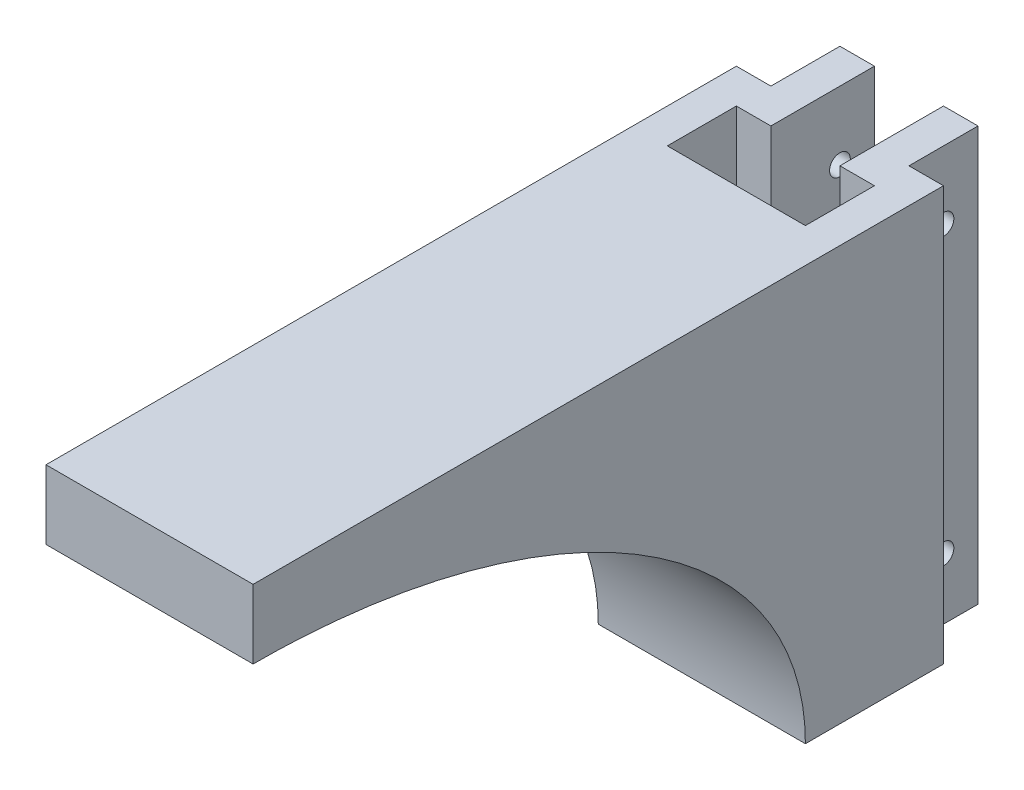
ISO-10303-21;
HEADER;
FILE_DESCRIPTION(('STEP AP214'),'2;1');
FILE_NAME('part.step','',(''),(''),'','','');
FILE_SCHEMA(('AUTOMOTIVE_DESIGN { 1 0 10303 214 1 1 1 1 }'));
ENDSEC;
DATA;
#1=APPLICATION_CONTEXT('core data for automotive mechanical design processes');
#2=APPLICATION_PROTOCOL_DEFINITION('international standard','automotive_design',2000,#1);
#3=PRODUCT_CONTEXT('',#1,'mechanical');
#4=PRODUCT('Part','Part','',(#3));
#5=PRODUCT_RELATED_PRODUCT_CATEGORY('part','',(#4));
#6=PRODUCT_DEFINITION_FORMATION('','',#4);
#7=PRODUCT_DEFINITION_CONTEXT('part definition',#1,'design');
#8=PRODUCT_DEFINITION('design','',#6,#7);
#9=PRODUCT_DEFINITION_SHAPE('','',#8);
#10=(LENGTH_UNIT() NAMED_UNIT(*) SI_UNIT(.MILLI.,.METRE.));
#11=(NAMED_UNIT(*) PLANE_ANGLE_UNIT() SI_UNIT($,.RADIAN.));
#12=(NAMED_UNIT(*) SI_UNIT($,.STERADIAN.) SOLID_ANGLE_UNIT());
#13=UNCERTAINTY_MEASURE_WITH_UNIT(LENGTH_MEASURE(1.E-05),#10,'distance_accuracy_value','');
#14=(GEOMETRIC_REPRESENTATION_CONTEXT(3) GLOBAL_UNCERTAINTY_ASSIGNED_CONTEXT((#13)) GLOBAL_UNIT_ASSIGNED_CONTEXT((#10,
#11,#12)) REPRESENTATION_CONTEXT('',''));
#15=CARTESIAN_POINT('',(0.,0.,0.));
#16=DIRECTION('',(0.,0.,1.));
#17=DIRECTION('',(1.,0.,0.));
#18=AXIS2_PLACEMENT_3D('',#15,#16,#17);
#19=CARTESIAN_POINT('',(-5.,60.,-20.));
#20=DIRECTION('',(-1.,0.,0.));
#21=DIRECTION('',(0.,0.,1.));
#22=AXIS2_PLACEMENT_3D('',#19,#20,#21);
#23=PLANE('',#22);
#24=CARTESIAN_POINT('',(-5.,50.141064744388,-15.));
#25=DIRECTION('',(-1.,0.,0.));
#26=DIRECTION('',(0.,0.,1.));
#27=AXIS2_PLACEMENT_3D('',#24,#25,#26);
#28=CIRCLE('',#27,1.5);
#29=CARTESIAN_POINT('',(-5.,50.141064744388,-13.5));
#30=VERTEX_POINT('',#29);
#31=EDGE_CURVE('E303',#30,#30,#28,.T.);
#32=ORIENTED_EDGE('',*,*,#31,.T.);
#33=EDGE_LOOP('',(#32));
#34=FACE_BOUND('',#33,.T.);
#35=CARTESIAN_POINT('',(-5.,8.81024275743576,-15.));
#36=DIRECTION('',(-1.,0.,0.));
#37=DIRECTION('',(0.,0.,1.));
#38=AXIS2_PLACEMENT_3D('',#35,#36,#37);
#39=CIRCLE('',#38,1.5);
#40=CARTESIAN_POINT('',(-5.,8.81024275743576,-13.5));
#41=VERTEX_POINT('',#40);
#42=EDGE_CURVE('E285',#41,#41,#39,.T.);
#43=ORIENTED_EDGE('',*,*,#42,.T.);
#44=EDGE_LOOP('',(#43));
#45=FACE_BOUND('',#44,.T.);
#46=DIRECTION('',(0.,0.,-1.));
#47=VECTOR('',#46,1.);
#48=CARTESIAN_POINT('',(-5.,0.,-20.));
#49=LINE('',#48,#47);
#50=CARTESIAN_POINT('',(-5.,0.,-5.));
#51=VERTEX_POINT('',#50);
#52=CARTESIAN_POINT('',(-5.,0.,-20.));
#53=VERTEX_POINT('',#52);
#54=EDGE_CURVE('E186',#51,#53,#49,.T.);
#55=ORIENTED_EDGE('',*,*,#54,.T.);
#56=DIRECTION('',(0.,-1.,0.));
#57=VECTOR('',#56,1.);
#58=CARTESIAN_POINT('',(-5.,60.,-20.));
#59=LINE('',#58,#57);
#60=CARTESIAN_POINT('',(-5.,60.,-20.));
#61=VERTEX_POINT('',#60);
#62=EDGE_CURVE('E11',#61,#53,#59,.T.);
#63=ORIENTED_EDGE('',*,*,#62,.F.);
#64=DIRECTION('',(0.,0.,-1.));
#65=VECTOR('',#64,1.);
#66=CARTESIAN_POINT('',(-5.,60.,-20.));
#67=LINE('',#66,#65);
#68=CARTESIAN_POINT('',(-5.,60.,-5.));
#69=VERTEX_POINT('',#68);
#70=EDGE_CURVE('E123',#69,#61,#67,.T.);
#71=ORIENTED_EDGE('',*,*,#70,.F.);
#72=DIRECTION('',(0.,-1.,0.));
#73=VECTOR('',#72,1.);
#74=CARTESIAN_POINT('',(-5.,60.,-5.));
#75=LINE('',#74,#73);
#76=EDGE_CURVE('E182',#69,#51,#75,.T.);
#77=ORIENTED_EDGE('',*,*,#76,.T.);
#78=EDGE_LOOP('',(#55,#63,#71,#77));
#79=FACE_BOUND('',#78,.T.);
#80=ADVANCED_FACE('F42',(#34,#45,#79),#23,.F.);
#81=CARTESIAN_POINT('',(-10.,60.,-20.));
#82=DIRECTION('',(0.,0.,-1.));
#83=DIRECTION('',(-1.,0.,0.));
#84=AXIS2_PLACEMENT_3D('',#81,#82,#83);
#85=PLANE('',#84);
#86=DIRECTION('',(1.,0.,0.));
#87=VECTOR('',#86,1.);
#88=CARTESIAN_POINT('',(-10.,0.,-20.));
#89=LINE('',#88,#87);
#90=CARTESIAN_POINT('',(-10.,0.,-20.));
#91=VERTEX_POINT('',#90);
#92=EDGE_CURVE('E190',#91,#53,#89,.T.);
#93=ORIENTED_EDGE('',*,*,#92,.F.);
#94=DIRECTION('',(0.,-1.,0.));
#95=VECTOR('',#94,1.);
#96=CARTESIAN_POINT('',(-10.,60.,-20.));
#97=LINE('',#96,#95);
#98=CARTESIAN_POINT('',(-10.,60.,-20.));
#99=VERTEX_POINT('',#98);
#100=EDGE_CURVE('E52',#99,#91,#97,.T.);
#101=ORIENTED_EDGE('',*,*,#100,.F.);
#102=DIRECTION('',(1.,0.,0.));
#103=VECTOR('',#102,1.);
#104=CARTESIAN_POINT('',(-10.,60.,-20.));
#105=LINE('',#104,#103);
#106=EDGE_CURVE('E404',#99,#61,#105,.T.);
#107=ORIENTED_EDGE('',*,*,#106,.T.);
#108=ORIENTED_EDGE('',*,*,#62,.T.);
#109=EDGE_LOOP('',(#93,#101,#107,#108));
#110=FACE_BOUND('',#109,.T.);
#111=ADVANCED_FACE('F381',(#110),#85,.T.);
#112=CARTESIAN_POINT('',(-10.,60.,-20.));
#113=DIRECTION('',(-1.,0.,0.));
#114=DIRECTION('',(0.,0.,1.));
#115=AXIS2_PLACEMENT_3D('',#112,#113,#114);
#116=PLANE('',#115);
#117=CARTESIAN_POINT('',(-10.,50.141064744388,-15.));
#118=DIRECTION('',(-1.,0.,0.));
#119=DIRECTION('',(0.,0.,1.));
#120=AXIS2_PLACEMENT_3D('',#117,#118,#119);
#121=CIRCLE('',#120,1.5);
#122=CARTESIAN_POINT('',(-10.,50.141064744388,-13.5));
#123=VERTEX_POINT('',#122);
#124=EDGE_CURVE('E279',#123,#123,#121,.T.);
#125=ORIENTED_EDGE('',*,*,#124,.F.);
#126=EDGE_LOOP('',(#125));
#127=FACE_BOUND('',#126,.T.);
#128=CARTESIAN_POINT('',(-10.,8.81024275743576,-15.));
#129=DIRECTION('',(-1.,0.,0.));
#130=DIRECTION('',(0.,0.,1.));
#131=AXIS2_PLACEMENT_3D('',#128,#129,#130);
#132=CIRCLE('',#131,1.5);
#133=CARTESIAN_POINT('',(-10.,8.81024275743576,-13.5));
#134=VERTEX_POINT('',#133);
#135=EDGE_CURVE('E288',#134,#134,#132,.T.);
#136=ORIENTED_EDGE('',*,*,#135,.F.);
#137=EDGE_LOOP('',(#136));
#138=FACE_BOUND('',#137,.T.);
#139=DIRECTION('',(0.,0.,-1.));
#140=VECTOR('',#139,1.);
#141=CARTESIAN_POINT('',(-10.,0.,-20.));
#142=LINE('',#141,#140);
#143=CARTESIAN_POINT('',(-10.,0.,-10.));
#144=VERTEX_POINT('',#143);
#145=EDGE_CURVE('E195',#144,#91,#142,.T.);
#146=ORIENTED_EDGE('',*,*,#145,.F.);
#147=DIRECTION('',(0.,-1.,0.));
#148=VECTOR('',#147,1.);
#149=CARTESIAN_POINT('',(-10.,60.,-10.));
#150=LINE('',#149,#148);
#151=CARTESIAN_POINT('',(-10.,60.,-10.));
#152=VERTEX_POINT('',#151);
#153=EDGE_CURVE('E271',#152,#144,#150,.T.);
#154=ORIENTED_EDGE('',*,*,#153,.F.);
#155=DIRECTION('',(0.,0.,-1.));
#156=VECTOR('',#155,1.);
#157=CARTESIAN_POINT('',(-10.,60.,-20.));
#158=LINE('',#157,#156);
#159=EDGE_CURVE('E399',#152,#99,#158,.T.);
#160=ORIENTED_EDGE('',*,*,#159,.T.);
#161=ORIENTED_EDGE('',*,*,#100,.T.);
#162=EDGE_LOOP('',(#146,#154,#160,#161));
#163=FACE_BOUND('',#162,.T.);
#164=ADVANCED_FACE('F378',(#127,#138,#163),#116,.T.);
#165=CARTESIAN_POINT('',(-5.,60.,-10.));
#166=DIRECTION('',(0.,0.,-1.));
#167=DIRECTION('',(-1.,0.,0.));
#168=AXIS2_PLACEMENT_3D('',#165,#166,#167);
#169=PLANE('',#168);
#170=DIRECTION('',(1.,0.,0.));
#171=VECTOR('',#170,1.);
#172=CARTESIAN_POINT('',(-5.,0.,-10.));
#173=LINE('',#172,#171);
#174=CARTESIAN_POINT('',(-15.,0.,-10.));
#175=VERTEX_POINT('',#174);
#176=EDGE_CURVE('E199',#175,#144,#173,.T.);
#177=ORIENTED_EDGE('',*,*,#176,.F.);
#178=DIRECTION('',(0.,-1.,0.));
#179=VECTOR('',#178,1.);
#180=CARTESIAN_POINT('',(-15.,60.,-10.));
#181=LINE('',#180,#179);
#182=CARTESIAN_POINT('',(-15.,60.,-10.));
#183=VERTEX_POINT('',#182);
#184=EDGE_CURVE('E268',#183,#175,#181,.T.);
#185=ORIENTED_EDGE('',*,*,#184,.F.);
#186=DIRECTION('',(1.,0.,0.));
#187=VECTOR('',#186,1.);
#188=CARTESIAN_POINT('',(-5.,60.,-10.));
#189=LINE('',#188,#187);
#190=EDGE_CURVE('E403',#183,#152,#189,.T.);
#191=ORIENTED_EDGE('',*,*,#190,.T.);
#192=ORIENTED_EDGE('',*,*,#153,.T.);
#193=EDGE_LOOP('',(#177,#185,#191,#192));
#194=FACE_BOUND('',#193,.T.);
#195=ADVANCED_FACE('F374',(#194),#169,.T.);
#196=CARTESIAN_POINT('',(-15.,60.,-5.));
#197=DIRECTION('',(-1.,0.,0.));
#198=DIRECTION('',(0.,0.,1.));
#199=AXIS2_PLACEMENT_3D('',#196,#197,#198);
#200=PLANE('',#199);
#201=DIRECTION('',(0.,0.,-1.));
#202=VECTOR('',#201,1.);
#203=CARTESIAN_POINT('',(-15.,0.,-5.));
#204=LINE('',#203,#202);
#205=CARTESIAN_POINT('',(-15.,0.,10.));
#206=VERTEX_POINT('',#205);
#207=EDGE_CURVE('E203',#206,#175,#204,.T.);
#208=ORIENTED_EDGE('',*,*,#207,.F.);
#209=CARTESIAN_POINT('',(-15.,0.,90.));
#210=DIRECTION('',(1.,0.,0.));
#211=DIRECTION('',(0.,0.,-1.));
#212=AXIS2_PLACEMENT_3D('',#209,#210,#211);
#213=ELLIPSE('',#212,80.,50.);
#214=CARTESIAN_POINT('',(-15.,50.,90.));
#215=VERTEX_POINT('',#214);
#216=EDGE_CURVE('E307',#206,#215,#213,.T.);
#217=ORIENTED_EDGE('',*,*,#216,.T.);
#218=DIRECTION('',(0.,1.,0.));
#219=VECTOR('',#218,1.);
#220=CARTESIAN_POINT('',(-15.,0.,90.));
#221=LINE('',#220,#219);
#222=CARTESIAN_POINT('',(-15.,60.,90.));
#223=VERTEX_POINT('',#222);
#224=EDGE_CURVE('E311',#215,#223,#221,.T.);
#225=ORIENTED_EDGE('',*,*,#224,.T.);
#226=DIRECTION('',(0.,0.,-1.));
#227=VECTOR('',#226,1.);
#228=CARTESIAN_POINT('',(-15.,60.,-5.));
#229=LINE('',#228,#227);
#230=EDGE_CURVE('E408',#223,#183,#229,.T.);
#231=ORIENTED_EDGE('',*,*,#230,.T.);
#232=ORIENTED_EDGE('',*,*,#184,.T.);
#233=EDGE_LOOP('',(#208,#217,#225,#231,#232));
#234=FACE_BOUND('',#233,.T.);
#235=ADVANCED_FACE('F370',(#234),#200,.T.);
#236=CARTESIAN_POINT('',(15.,60.,-5.));
#237=DIRECTION('',(1.,0.,0.));
#238=DIRECTION('',(0.,0.,-1.));
#239=AXIS2_PLACEMENT_3D('',#236,#237,#238);
#240=PLANE('',#239);
#241=DIRECTION('',(0.,0.,-1.));
#242=VECTOR('',#241,1.);
#243=CARTESIAN_POINT('',(15.,0.,-5.));
#244=LINE('',#243,#242);
#245=CARTESIAN_POINT('',(15.,0.,-10.));
#246=VERTEX_POINT('',#245);
#247=CARTESIAN_POINT('',(15.,0.,10.));
#248=VERTEX_POINT('',#247);
#249=EDGE_CURVE('E211',#246,#248,#244,.F.);
#250=ORIENTED_EDGE('',*,*,#249,.F.);
#251=DIRECTION('',(0.,-1.,0.));
#252=VECTOR('',#251,1.);
#253=CARTESIAN_POINT('',(15.,60.,-10.));
#254=LINE('',#253,#252);
#255=CARTESIAN_POINT('',(15.,60.,-10.));
#256=VERTEX_POINT('',#255);
#257=EDGE_CURVE('E265',#256,#246,#254,.T.);
#258=ORIENTED_EDGE('',*,*,#257,.F.);
#259=DIRECTION('',(0.,0.,-1.));
#260=VECTOR('',#259,1.);
#261=CARTESIAN_POINT('',(15.,60.,-5.));
#262=LINE('',#261,#260);
#263=CARTESIAN_POINT('',(15.,60.,90.));
#264=VERTEX_POINT('',#263);
#265=EDGE_CURVE('E416',#256,#264,#262,.F.);
#266=ORIENTED_EDGE('',*,*,#265,.T.);
#267=DIRECTION('',(0.,1.,0.));
#268=VECTOR('',#267,1.);
#269=CARTESIAN_POINT('',(15.,0.,90.));
#270=LINE('',#269,#268);
#271=CARTESIAN_POINT('',(15.,50.,90.));
#272=VERTEX_POINT('',#271);
#273=EDGE_CURVE('E320',#272,#264,#270,.T.);
#274=ORIENTED_EDGE('',*,*,#273,.F.);
#275=CARTESIAN_POINT('',(15.,0.,90.));
#276=DIRECTION('',(1.,0.,0.));
#277=DIRECTION('',(0.,0.,-1.));
#278=AXIS2_PLACEMENT_3D('',#275,#276,#277);
#279=ELLIPSE('',#278,80.,50.);
#280=EDGE_CURVE('E315',#248,#272,#279,.T.);
#281=ORIENTED_EDGE('',*,*,#280,.F.);
#282=EDGE_LOOP('',(#250,#258,#266,#274,#281));
#283=FACE_BOUND('',#282,.T.);
#284=ADVANCED_FACE('F366',(#283),#240,.T.);
#285=CARTESIAN_POINT('',(5.,60.,-10.));
#286=DIRECTION('',(0.,0.,-1.));
#287=DIRECTION('',(-1.,0.,0.));
#288=AXIS2_PLACEMENT_3D('',#285,#286,#287);
#289=PLANE('',#288);
#290=DIRECTION('',(1.,0.,0.));
#291=VECTOR('',#290,1.);
#292=CARTESIAN_POINT('',(5.,0.,-10.));
#293=LINE('',#292,#291);
#294=CARTESIAN_POINT('',(10.,0.,-10.));
#295=VERTEX_POINT('',#294);
#296=EDGE_CURVE('E215',#295,#246,#293,.T.);
#297=ORIENTED_EDGE('',*,*,#296,.F.);
#298=DIRECTION('',(0.,-1.,0.));
#299=VECTOR('',#298,1.);
#300=CARTESIAN_POINT('',(10.,60.,-10.));
#301=LINE('',#300,#299);
#302=CARTESIAN_POINT('',(10.,60.,-10.));
#303=VERTEX_POINT('',#302);
#304=EDGE_CURVE('E262',#303,#295,#301,.T.);
#305=ORIENTED_EDGE('',*,*,#304,.F.);
#306=DIRECTION('',(1.,0.,0.));
#307=VECTOR('',#306,1.);
#308=CARTESIAN_POINT('',(5.,60.,-10.));
#309=LINE('',#308,#307);
#310=EDGE_CURVE('E420',#303,#256,#309,.T.);
#311=ORIENTED_EDGE('',*,*,#310,.T.);
#312=ORIENTED_EDGE('',*,*,#257,.T.);
#313=EDGE_LOOP('',(#297,#305,#311,#312));
#314=FACE_BOUND('',#313,.T.);
#315=ADVANCED_FACE('F362',(#314),#289,.T.);
#316=CARTESIAN_POINT('',(10.,60.,-20.));
#317=DIRECTION('',(1.,0.,0.));
#318=DIRECTION('',(0.,0.,-1.));
#319=AXIS2_PLACEMENT_3D('',#316,#317,#318);
#320=PLANE('',#319);
#321=CARTESIAN_POINT('',(10.,50.141064744388,-15.));
#322=DIRECTION('',(1.,0.,0.));
#323=DIRECTION('',(0.,0.,-1.));
#324=AXIS2_PLACEMENT_3D('',#321,#322,#323);
#325=CIRCLE('',#324,1.5);
#326=CARTESIAN_POINT('',(10.,50.141064744388,-13.5));
#327=VERTEX_POINT('',#326);
#328=EDGE_CURVE('E299',#327,#327,#325,.T.);
#329=ORIENTED_EDGE('',*,*,#328,.F.);
#330=EDGE_LOOP('',(#329));
#331=FACE_BOUND('',#330,.T.);
#332=CARTESIAN_POINT('',(10.,8.81024275743576,-15.));
#333=DIRECTION('',(1.,0.,0.));
#334=DIRECTION('',(0.,0.,-1.));
#335=AXIS2_PLACEMENT_3D('',#332,#333,#334);
#336=CIRCLE('',#335,1.5);
#337=CARTESIAN_POINT('',(10.,8.81024275743576,-13.5));
#338=VERTEX_POINT('',#337);
#339=EDGE_CURVE('E278',#338,#338,#336,.T.);
#340=ORIENTED_EDGE('',*,*,#339,.F.);
#341=EDGE_LOOP('',(#340));
#342=FACE_BOUND('',#341,.T.);
#343=DIRECTION('',(0.,0.,1.));
#344=VECTOR('',#343,1.);
#345=CARTESIAN_POINT('',(10.,0.,-20.));
#346=LINE('',#345,#344);
#347=CARTESIAN_POINT('',(10.,0.,-20.));
#348=VERTEX_POINT('',#347);
#349=EDGE_CURVE('E219',#348,#295,#346,.T.);
#350=ORIENTED_EDGE('',*,*,#349,.F.);
#351=DIRECTION('',(0.,-1.,0.));
#352=VECTOR('',#351,1.);
#353=CARTESIAN_POINT('',(10.,60.,-20.));
#354=LINE('',#353,#352);
#355=CARTESIAN_POINT('',(10.,60.,-20.));
#356=VERTEX_POINT('',#355);
#357=EDGE_CURVE('E259',#356,#348,#354,.T.);
#358=ORIENTED_EDGE('',*,*,#357,.F.);
#359=DIRECTION('',(0.,0.,1.));
#360=VECTOR('',#359,1.);
#361=CARTESIAN_POINT('',(10.,60.,-20.));
#362=LINE('',#361,#360);
#363=EDGE_CURVE('E424',#356,#303,#362,.T.);
#364=ORIENTED_EDGE('',*,*,#363,.T.);
#365=ORIENTED_EDGE('',*,*,#304,.T.);
#366=EDGE_LOOP('',(#350,#358,#364,#365));
#367=FACE_BOUND('',#366,.T.);
#368=ADVANCED_FACE('F358',(#331,#342,#367),#320,.T.);
#369=CARTESIAN_POINT('',(5.,60.,-20.));
#370=DIRECTION('',(0.,0.,-1.));
#371=DIRECTION('',(-1.,0.,0.));
#372=AXIS2_PLACEMENT_3D('',#369,#370,#371);
#373=PLANE('',#372);
#374=DIRECTION('',(1.,0.,0.));
#375=VECTOR('',#374,1.);
#376=CARTESIAN_POINT('',(5.,0.,-20.));
#377=LINE('',#376,#375);
#378=CARTESIAN_POINT('',(5.,0.,-20.));
#379=VERTEX_POINT('',#378);
#380=EDGE_CURVE('E223',#379,#348,#377,.T.);
#381=ORIENTED_EDGE('',*,*,#380,.F.);
#382=DIRECTION('',(0.,-1.,0.));
#383=VECTOR('',#382,1.);
#384=CARTESIAN_POINT('',(5.,60.,-20.));
#385=LINE('',#384,#383);
#386=CARTESIAN_POINT('',(5.,60.,-20.));
#387=VERTEX_POINT('',#386);
#388=EDGE_CURVE('E256',#387,#379,#385,.T.);
#389=ORIENTED_EDGE('',*,*,#388,.F.);
#390=DIRECTION('',(1.,0.,0.));
#391=VECTOR('',#390,1.);
#392=CARTESIAN_POINT('',(5.,60.,-20.));
#393=LINE('',#392,#391);
#394=EDGE_CURVE('E428',#387,#356,#393,.T.);
#395=ORIENTED_EDGE('',*,*,#394,.T.);
#396=ORIENTED_EDGE('',*,*,#357,.T.);
#397=EDGE_LOOP('',(#381,#389,#395,#396));
#398=FACE_BOUND('',#397,.T.);
#399=ADVANCED_FACE('F354',(#398),#373,.T.);
#400=CARTESIAN_POINT('',(5.,60.,-20.));
#401=DIRECTION('',(1.,0.,0.));
#402=DIRECTION('',(0.,0.,-1.));
#403=AXIS2_PLACEMENT_3D('',#400,#401,#402);
#404=PLANE('',#403);
#405=CARTESIAN_POINT('',(5.,50.141064744388,-15.));
#406=DIRECTION('',(1.,0.,0.));
#407=DIRECTION('',(0.,0.,-1.));
#408=AXIS2_PLACEMENT_3D('',#405,#406,#407);
#409=CIRCLE('',#408,1.5);
#410=CARTESIAN_POINT('',(5.,50.141064744388,-13.5));
#411=VERTEX_POINT('',#410);
#412=EDGE_CURVE('E45',#411,#411,#409,.T.);
#413=ORIENTED_EDGE('',*,*,#412,.T.);
#414=EDGE_LOOP('',(#413));
#415=FACE_BOUND('',#414,.T.);
#416=CARTESIAN_POINT('',(5.,8.81024275743576,-15.));
#417=DIRECTION('',(1.,0.,0.));
#418=DIRECTION('',(0.,0.,-1.));
#419=AXIS2_PLACEMENT_3D('',#416,#417,#418);
#420=CIRCLE('',#419,1.5);
#421=CARTESIAN_POINT('',(5.,8.81024275743576,-13.5));
#422=VERTEX_POINT('',#421);
#423=EDGE_CURVE('E275',#422,#422,#420,.T.);
#424=ORIENTED_EDGE('',*,*,#423,.T.);
#425=EDGE_LOOP('',(#424));
#426=FACE_BOUND('',#425,.T.);
#427=DIRECTION('',(0.,0.,1.));
#428=VECTOR('',#427,1.);
#429=CARTESIAN_POINT('',(5.,0.,-20.));
#430=LINE('',#429,#428);
#431=CARTESIAN_POINT('',(5.,0.,-5.));
#432=VERTEX_POINT('',#431);
#433=EDGE_CURVE('E227',#379,#432,#430,.T.);
#434=ORIENTED_EDGE('',*,*,#433,.T.);
#435=DIRECTION('',(0.,-1.,0.));
#436=VECTOR('',#435,1.);
#437=CARTESIAN_POINT('',(5.,60.,-5.));
#438=LINE('',#437,#436);
#439=CARTESIAN_POINT('',(5.,60.,-5.));
#440=VERTEX_POINT('',#439);
#441=EDGE_CURVE('E252',#440,#432,#438,.T.);
#442=ORIENTED_EDGE('',*,*,#441,.F.);
#443=DIRECTION('',(0.,0.,1.));
#444=VECTOR('',#443,1.);
#445=CARTESIAN_POINT('',(5.,60.,-20.));
#446=LINE('',#445,#444);
#447=EDGE_CURVE('E432',#387,#440,#446,.T.);
#448=ORIENTED_EDGE('',*,*,#447,.F.);
#449=ORIENTED_EDGE('',*,*,#388,.T.);
#450=EDGE_LOOP('',(#434,#442,#448,#449));
#451=FACE_BOUND('',#450,.T.);
#452=ADVANCED_FACE('F350',(#415,#426,#451),#404,.F.);
#453=CARTESIAN_POINT('',(5.,60.,-5.));
#454=DIRECTION('',(0.,0.,-1.));
#455=DIRECTION('',(-1.,0.,0.));
#456=AXIS2_PLACEMENT_3D('',#453,#454,#455);
#457=PLANE('',#456);
#458=DIRECTION('',(1.,0.,0.));
#459=VECTOR('',#458,1.);
#460=CARTESIAN_POINT('',(5.,0.,-5.));
#461=LINE('',#460,#459);
#462=CARTESIAN_POINT('',(10.,0.,-5.));
#463=VERTEX_POINT('',#462);
#464=EDGE_CURVE('E230',#432,#463,#461,.T.);
#465=ORIENTED_EDGE('',*,*,#464,.T.);
#466=DIRECTION('',(0.,-1.,0.));
#467=VECTOR('',#466,1.);
#468=CARTESIAN_POINT('',(10.,60.,-5.));
#469=LINE('',#468,#467);
#470=CARTESIAN_POINT('',(10.,60.,-5.));
#471=VERTEX_POINT('',#470);
#472=EDGE_CURVE('E248',#471,#463,#469,.T.);
#473=ORIENTED_EDGE('',*,*,#472,.F.);
#474=DIRECTION('',(1.,0.,0.));
#475=VECTOR('',#474,1.);
#476=CARTESIAN_POINT('',(5.,60.,-5.));
#477=LINE('',#476,#475);
#478=EDGE_CURVE('E435',#440,#471,#477,.T.);
#479=ORIENTED_EDGE('',*,*,#478,.F.);
#480=ORIENTED_EDGE('',*,*,#441,.T.);
#481=EDGE_LOOP('',(#465,#473,#479,#480));
#482=FACE_BOUND('',#481,.T.);
#483=ADVANCED_FACE('F346',(#482),#457,.F.);
#484=CARTESIAN_POINT('',(10.,60.,-5.));
#485=DIRECTION('',(1.,0.,0.));
#486=DIRECTION('',(0.,0.,-1.));
#487=AXIS2_PLACEMENT_3D('',#484,#485,#486);
#488=PLANE('',#487);
#489=DIRECTION('',(0.,0.,1.));
#490=VECTOR('',#489,1.);
#491=CARTESIAN_POINT('',(10.,0.,-5.));
#492=LINE('',#491,#490);
#493=CARTESIAN_POINT('',(10.,0.,5.));
#494=VERTEX_POINT('',#493);
#495=EDGE_CURVE('E233',#463,#494,#492,.T.);
#496=ORIENTED_EDGE('',*,*,#495,.T.);
#497=DIRECTION('',(0.,-1.,0.));
#498=VECTOR('',#497,1.);
#499=CARTESIAN_POINT('',(10.,60.,5.));
#500=LINE('',#499,#498);
#501=CARTESIAN_POINT('',(10.,60.,5.));
#502=VERTEX_POINT('',#501);
#503=EDGE_CURVE('E175',#502,#494,#500,.T.);
#504=ORIENTED_EDGE('',*,*,#503,.F.);
#505=DIRECTION('',(0.,0.,1.));
#506=VECTOR('',#505,1.);
#507=CARTESIAN_POINT('',(10.,60.,-5.));
#508=LINE('',#507,#506);
#509=EDGE_CURVE('E164',#471,#502,#508,.T.);
#510=ORIENTED_EDGE('',*,*,#509,.F.);
#511=ORIENTED_EDGE('',*,*,#472,.T.);
#512=EDGE_LOOP('',(#496,#504,#510,#511));
#513=FACE_BOUND('',#512,.T.);
#514=ADVANCED_FACE('F343',(#513),#488,.F.);
#515=CARTESIAN_POINT('',(-10.,60.,5.));
#516=DIRECTION('',(0.,0.,1.));
#517=DIRECTION('',(1.,0.,0.));
#518=AXIS2_PLACEMENT_3D('',#515,#516,#517);
#519=PLANE('',#518);
#520=DIRECTION('',(-1.,0.,0.));
#521=VECTOR('',#520,1.);
#522=CARTESIAN_POINT('',(-10.,0.,5.));
#523=LINE('',#522,#521);
#524=CARTESIAN_POINT('',(-10.,0.,5.));
#525=VERTEX_POINT('',#524);
#526=EDGE_CURVE('E173',#494,#525,#523,.T.);
#527=ORIENTED_EDGE('',*,*,#526,.T.);
#528=DIRECTION('',(0.,-1.,0.));
#529=VECTOR('',#528,1.);
#530=CARTESIAN_POINT('',(-10.,60.,5.));
#531=LINE('',#530,#529);
#532=CARTESIAN_POINT('',(-10.,60.,5.));
#533=VERTEX_POINT('',#532);
#534=EDGE_CURVE('E170',#533,#525,#531,.T.);
#535=ORIENTED_EDGE('',*,*,#534,.F.);
#536=DIRECTION('',(-1.,0.,0.));
#537=VECTOR('',#536,1.);
#538=CARTESIAN_POINT('',(-10.,60.,5.));
#539=LINE('',#538,#537);
#540=EDGE_CURVE('E158',#502,#533,#539,.T.);
#541=ORIENTED_EDGE('',*,*,#540,.F.);
#542=ORIENTED_EDGE('',*,*,#503,.T.);
#543=EDGE_LOOP('',(#527,#535,#541,#542));
#544=FACE_BOUND('',#543,.T.);
#545=ADVANCED_FACE('F171',(#544),#519,.F.);
#546=CARTESIAN_POINT('',(-10.,60.,-5.));
#547=DIRECTION('',(-1.,0.,0.));
#548=DIRECTION('',(0.,0.,1.));
#549=AXIS2_PLACEMENT_3D('',#546,#547,#548);
#550=PLANE('',#549);
#551=DIRECTION('',(0.,0.,-1.));
#552=VECTOR('',#551,1.);
#553=CARTESIAN_POINT('',(-10.,0.,-5.));
#554=LINE('',#553,#552);
#555=CARTESIAN_POINT('',(-10.,0.,-5.));
#556=VERTEX_POINT('',#555);
#557=EDGE_CURVE('E111',#525,#556,#554,.T.);
#558=ORIENTED_EDGE('',*,*,#557,.T.);
#559=DIRECTION('',(0.,-1.,0.));
#560=VECTOR('',#559,1.);
#561=CARTESIAN_POINT('',(-10.,60.,-5.));
#562=LINE('',#561,#560);
#563=CARTESIAN_POINT('',(-10.,60.,-5.));
#564=VERTEX_POINT('',#563);
#565=EDGE_CURVE('E176',#564,#556,#562,.T.);
#566=ORIENTED_EDGE('',*,*,#565,.F.);
#567=DIRECTION('',(0.,0.,-1.));
#568=VECTOR('',#567,1.);
#569=CARTESIAN_POINT('',(-10.,60.,-5.));
#570=LINE('',#569,#568);
#571=EDGE_CURVE('E162',#533,#564,#570,.T.);
#572=ORIENTED_EDGE('',*,*,#571,.F.);
#573=ORIENTED_EDGE('',*,*,#534,.T.);
#574=EDGE_LOOP('',(#558,#566,#572,#573));
#575=FACE_BOUND('',#574,.T.);
#576=ADVANCED_FACE('F178',(#575),#550,.F.);
#577=CARTESIAN_POINT('',(-5.,60.,-5.));
#578=DIRECTION('',(0.,0.,-1.));
#579=DIRECTION('',(-1.,0.,0.));
#580=AXIS2_PLACEMENT_3D('',#577,#578,#579);
#581=PLANE('',#580);
#582=DIRECTION('',(1.,0.,0.));
#583=VECTOR('',#582,1.);
#584=CARTESIAN_POINT('',(-5.,0.,-5.));
#585=LINE('',#584,#583);
#586=EDGE_CURVE('E117',#556,#51,#585,.T.);
#587=ORIENTED_EDGE('',*,*,#586,.T.);
#588=ORIENTED_EDGE('',*,*,#76,.F.);
#589=DIRECTION('',(1.,0.,0.));
#590=VECTOR('',#589,1.);
#591=CARTESIAN_POINT('',(-5.,60.,-5.));
#592=LINE('',#591,#590);
#593=EDGE_CURVE('E61',#564,#69,#592,.T.);
#594=ORIENTED_EDGE('',*,*,#593,.F.);
#595=ORIENTED_EDGE('',*,*,#565,.T.);
#596=EDGE_LOOP('',(#587,#588,#594,#595));
#597=FACE_BOUND('',#596,.T.);
#598=ADVANCED_FACE('F333',(#597),#581,.F.);
#599=CARTESIAN_POINT('',(0.,60.,0.));
#600=DIRECTION('',(0.,-1.,0.));
#601=DIRECTION('',(-1.,0.,0.));
#602=AXIS2_PLACEMENT_3D('',#599,#600,#601);
#603=PLANE('',#602);
#604=ORIENTED_EDGE('',*,*,#70,.T.);
#605=ORIENTED_EDGE('',*,*,#106,.F.);
#606=ORIENTED_EDGE('',*,*,#159,.F.);
#607=ORIENTED_EDGE('',*,*,#190,.F.);
#608=ORIENTED_EDGE('',*,*,#230,.F.);
#609=DIRECTION('',(-1.,0.,0.));
#610=VECTOR('',#609,1.);
#611=CARTESIAN_POINT('',(15.,60.,90.));
#612=LINE('',#611,#610);
#613=EDGE_CURVE('E191',#264,#223,#612,.T.);
#614=ORIENTED_EDGE('',*,*,#613,.F.);
#615=ORIENTED_EDGE('',*,*,#265,.F.);
#616=ORIENTED_EDGE('',*,*,#310,.F.);
#617=ORIENTED_EDGE('',*,*,#363,.F.);
#618=ORIENTED_EDGE('',*,*,#394,.F.);
#619=ORIENTED_EDGE('',*,*,#447,.T.);
#620=ORIENTED_EDGE('',*,*,#478,.T.);
#621=ORIENTED_EDGE('',*,*,#509,.T.);
#622=ORIENTED_EDGE('',*,*,#540,.T.);
#623=ORIENTED_EDGE('',*,*,#571,.T.);
#624=ORIENTED_EDGE('',*,*,#593,.T.);
#625=EDGE_LOOP('',(#604,#605,#606,#607,#608,#614,#615,#616,#617,#618,#619,#620,#621,#622,#623,#624));
#626=FACE_BOUND('',#625,.T.);
#627=ADVANCED_FACE('F160',(#626),#603,.F.);
#628=CARTESIAN_POINT('',(0.,0.,0.));
#629=DIRECTION('',(0.,-1.,0.));
#630=DIRECTION('',(-1.,0.,0.));
#631=AXIS2_PLACEMENT_3D('',#628,#629,#630);
#632=PLANE('',#631);
#633=ORIENTED_EDGE('',*,*,#54,.F.);
#634=ORIENTED_EDGE('',*,*,#586,.F.);
#635=ORIENTED_EDGE('',*,*,#557,.F.);
#636=ORIENTED_EDGE('',*,*,#526,.F.);
#637=ORIENTED_EDGE('',*,*,#495,.F.);
#638=ORIENTED_EDGE('',*,*,#464,.F.);
#639=ORIENTED_EDGE('',*,*,#433,.F.);
#640=ORIENTED_EDGE('',*,*,#380,.T.);
#641=ORIENTED_EDGE('',*,*,#349,.T.);
#642=ORIENTED_EDGE('',*,*,#296,.T.);
#643=ORIENTED_EDGE('',*,*,#249,.T.);
#644=DIRECTION('',(1.,0.,0.));
#645=VECTOR('',#644,1.);
#646=CARTESIAN_POINT('',(-10.,0.,10.));
#647=LINE('',#646,#645);
#648=EDGE_CURVE('E207',#248,#206,#647,.F.);
#649=ORIENTED_EDGE('',*,*,#648,.T.);
#650=ORIENTED_EDGE('',*,*,#207,.T.);
#651=ORIENTED_EDGE('',*,*,#176,.T.);
#652=ORIENTED_EDGE('',*,*,#145,.T.);
#653=ORIENTED_EDGE('',*,*,#92,.T.);
#654=EDGE_LOOP('',(#633,#634,#635,#636,#637,#638,#639,#640,#641,#642,#643,#649,#650,#651,#652,#653));
#655=FACE_BOUND('',#654,.T.);
#656=ADVANCED_FACE('F328',(#655),#632,.T.);
#657=DIRECTION('',(-1.,0.,0.));
#658=VECTOR('',#657,1.);
#659=SURFACE_OF_LINEAR_EXTRUSION('',#279,#658);
#660=DIRECTION('',(-1.,0.,0.));
#661=VECTOR('',#660,1.);
#662=CARTESIAN_POINT('',(15.,50.,90.));
#663=LINE('',#662,#661);
#664=EDGE_CURVE('E450',#272,#215,#663,.T.);
#665=ORIENTED_EDGE('',*,*,#664,.T.);
#666=ORIENTED_EDGE('',*,*,#216,.F.);
#667=ORIENTED_EDGE('',*,*,#648,.F.);
#668=ORIENTED_EDGE('',*,*,#280,.T.);
#669=EDGE_LOOP('',(#665,#666,#667,#668));
#670=FACE_BOUND('',#669,.T.);
#671=ADVANCED_FACE('F323',(#670),#659,.T.);
#672=CARTESIAN_POINT('',(15.,0.,90.));
#673=DIRECTION('',(0.,0.,1.));
#674=DIRECTION('',(1.,0.,0.));
#675=AXIS2_PLACEMENT_3D('',#672,#673,#674);
#676=PLANE('',#675);
#677=ORIENTED_EDGE('',*,*,#613,.T.);
#678=ORIENTED_EDGE('',*,*,#224,.F.);
#679=ORIENTED_EDGE('',*,*,#664,.F.);
#680=ORIENTED_EDGE('',*,*,#273,.T.);
#681=EDGE_LOOP('',(#677,#678,#679,#680));
#682=FACE_BOUND('',#681,.T.);
#683=ADVANCED_FACE('F327',(#682),#676,.T.);
#684=CARTESIAN_POINT('',(15.,8.81024275743576,-15.));
#685=DIRECTION('',(-1.,0.,0.));
#686=DIRECTION('',(0.,0.,1.));
#687=AXIS2_PLACEMENT_3D('',#684,#685,#686);
#688=CYLINDRICAL_SURFACE('',#687,1.5);
#689=CARTESIAN_POINT('',(10.,8.81024275743576,-13.5));
#690=CARTESIAN_POINT('',(9.94791666666667,8.81024275743576,-13.5));
#691=CARTESIAN_POINT('',(9.89583333333333,8.81024275743576,-13.5));
#692=CARTESIAN_POINT('',(9.79166666666667,8.81024275743576,-13.5));
#693=CARTESIAN_POINT('',(9.73958333333333,8.81024275743576,-13.5));
#694=CARTESIAN_POINT('',(9.63541666666667,8.81024275743576,-13.5));
#695=CARTESIAN_POINT('',(9.58333333333333,8.81024275743576,-13.5));
#696=CARTESIAN_POINT('',(9.47916666666667,8.81024275743576,-13.5));
#697=CARTESIAN_POINT('',(9.42708333333333,8.81024275743576,-13.5));
#698=CARTESIAN_POINT('',(9.32291666666667,8.81024275743576,-13.5));
#699=CARTESIAN_POINT('',(9.27083333333333,8.81024275743576,-13.5));
#700=CARTESIAN_POINT('',(9.16666666666667,8.81024275743576,-13.5));
#701=CARTESIAN_POINT('',(9.11458333333333,8.81024275743576,-13.5));
#702=CARTESIAN_POINT('',(9.01041666666667,8.81024275743576,-13.5));
#703=CARTESIAN_POINT('',(8.95833333333333,8.81024275743576,-13.5));
#704=CARTESIAN_POINT('',(8.85416666666667,8.81024275743576,-13.5));
#705=CARTESIAN_POINT('',(8.80208333333333,8.81024275743576,-13.5));
#706=CARTESIAN_POINT('',(8.69791666666667,8.81024275743576,-13.5));
#707=CARTESIAN_POINT('',(8.64583333333333,8.81024275743576,-13.5));
#708=CARTESIAN_POINT('',(8.54166666666667,8.81024275743576,-13.5));
#709=CARTESIAN_POINT('',(8.48958333333333,8.81024275743576,-13.5));
#710=CARTESIAN_POINT('',(8.38541666666667,8.81024275743576,-13.5));
#711=CARTESIAN_POINT('',(8.33333333333333,8.81024275743576,-13.5));
#712=CARTESIAN_POINT('',(8.22916666666667,8.81024275743576,-13.5));
#713=CARTESIAN_POINT('',(8.17708333333333,8.81024275743576,-13.5));
#714=CARTESIAN_POINT('',(8.07291666666667,8.81024275743576,-13.5));
#715=CARTESIAN_POINT('',(8.02083333333333,8.81024275743576,-13.5));
#716=CARTESIAN_POINT('',(7.91666666666667,8.81024275743576,-13.5));
#717=CARTESIAN_POINT('',(7.86458333333333,8.81024275743576,-13.5));
#718=CARTESIAN_POINT('',(7.76041666666667,8.81024275743576,-13.5));
#719=CARTESIAN_POINT('',(7.70833333333333,8.81024275743576,-13.5));
#720=CARTESIAN_POINT('',(7.60416666666667,8.81024275743576,-13.5));
#721=CARTESIAN_POINT('',(7.55208333333333,8.81024275743576,-13.5));
#722=CARTESIAN_POINT('',(7.44791666666667,8.81024275743576,-13.5));
#723=CARTESIAN_POINT('',(7.39583333333333,8.81024275743576,-13.5));
#724=CARTESIAN_POINT('',(7.29166666666667,8.81024275743576,-13.5));
#725=CARTESIAN_POINT('',(7.23958333333333,8.81024275743576,-13.5));
#726=CARTESIAN_POINT('',(7.13541666666667,8.81024275743576,-13.5));
#727=CARTESIAN_POINT('',(7.08333333333333,8.81024275743576,-13.5));
#728=CARTESIAN_POINT('',(6.97916666666667,8.81024275743576,-13.5));
#729=CARTESIAN_POINT('',(6.92708333333333,8.81024275743576,-13.5));
#730=CARTESIAN_POINT('',(6.82291666666667,8.81024275743576,-13.5));
#731=CARTESIAN_POINT('',(6.77083333333333,8.81024275743576,-13.5));
#732=CARTESIAN_POINT('',(6.66666666666667,8.81024275743576,-13.5));
#733=CARTESIAN_POINT('',(6.61458333333333,8.81024275743576,-13.5));
#734=CARTESIAN_POINT('',(6.51041666666667,8.81024275743576,-13.5));
#735=CARTESIAN_POINT('',(6.45833333333333,8.81024275743576,-13.5));
#736=CARTESIAN_POINT('',(6.35416666666667,8.81024275743576,-13.5));
#737=CARTESIAN_POINT('',(6.30208333333333,8.81024275743576,-13.5));
#738=CARTESIAN_POINT('',(6.19791666666667,8.81024275743576,-13.5));
#739=CARTESIAN_POINT('',(6.14583333333333,8.81024275743576,-13.5));
#740=CARTESIAN_POINT('',(6.04166666666667,8.81024275743576,-13.5));
#741=CARTESIAN_POINT('',(5.98958333333333,8.81024275743576,-13.5));
#742=CARTESIAN_POINT('',(5.88541666666667,8.81024275743576,-13.5));
#743=CARTESIAN_POINT('',(5.83333333333334,8.81024275743576,-13.5));
#744=CARTESIAN_POINT('',(5.72916666666667,8.81024275743576,-13.5));
#745=CARTESIAN_POINT('',(5.67708333333333,8.81024275743576,-13.5));
#746=CARTESIAN_POINT('',(5.57291666666667,8.81024275743576,-13.5));
#747=CARTESIAN_POINT('',(5.52083333333333,8.81024275743576,-13.5));
#748=CARTESIAN_POINT('',(5.41666666666667,8.81024275743576,-13.5));
#749=CARTESIAN_POINT('',(5.36458333333333,8.81024275743576,-13.5));
#750=CARTESIAN_POINT('',(5.26041666666667,8.81024275743576,-13.5));
#751=CARTESIAN_POINT('',(5.20833333333333,8.81024275743576,-13.5));
#752=CARTESIAN_POINT('',(5.10416666666667,8.81024275743576,-13.5));
#753=CARTESIAN_POINT('',(5.05208333333333,8.81024275743576,-13.5));
#754=CARTESIAN_POINT('',(5.,8.81024275743576,-13.5));
#755=B_SPLINE_CURVE_WITH_KNOTS('',3,(#689,#690,#691,#692,#693,#694,#695,#696,#697,#698,#699,
#700,#701,#702,#703,#704,#705,#706,#707,#708,#709,#710,#711,#712,#713,#714,#715,#716,#717,#718,
#719,#720,#721,#722,#723,#724,#725,#726,#727,#728,#729,#730,#731,#732,#733,#734,#735,#736,#737,
#738,#739,#740,#741,#742,#743,#744,#745,#746,#747,#748,#749,#750,#751,#752,#753,#754),
.UNSPECIFIED.,.F.,.F.,(4,2,2,2,2,2,2,2,2,2,2,2,2,2,2,2,2,2,2,2,2,2,2,2,2,2,2,2,2,2,2,2,4),(0.,
0.15625,0.3125,0.468749999999999,0.624999999999999,0.781249999999999,0.937499999999999,1.09375,
1.25,1.40625,1.5625,1.71875,1.875,2.03125,2.1875,2.34375,2.5,2.65625,2.8125,2.96875,3.125,
3.28125,3.4375,3.59375,3.75,3.90625,4.0625,4.21875,4.375,4.53125,4.6875,4.84375,5.),.UNSPECIFIED.);
#756=EDGE_CURVE('BSEAM482',#338,#422,#755,.T.);
#757=ORIENTED_EDGE('',*,*,#339,.T.);
#758=ORIENTED_EDGE('',*,*,#423,.F.);
#759=ORIENTED_EDGE('',*,*,#756,.T.);
#760=ORIENTED_EDGE('',*,*,#756,.F.);
#761=EDGE_LOOP('',(#757,#759,#758,#760));
#762=FACE_BOUND('',#761,.T.);
#763=ADVANCED_FACE('F482',(#762),#688,.F.);
#764=CARTESIAN_POINT('',(15.,50.141064744388,-15.));
#765=DIRECTION('',(-1.,0.,0.));
#766=DIRECTION('',(0.,0.,1.));
#767=AXIS2_PLACEMENT_3D('',#764,#765,#766);
#768=CYLINDRICAL_SURFACE('',#767,1.5);
#769=CARTESIAN_POINT('',(10.,50.141064744388,-13.5));
#770=CARTESIAN_POINT('',(9.94791666666667,50.141064744388,-13.5));
#771=CARTESIAN_POINT('',(9.89583333333333,50.141064744388,-13.5));
#772=CARTESIAN_POINT('',(9.79166666666667,50.141064744388,-13.5));
#773=CARTESIAN_POINT('',(9.73958333333333,50.141064744388,-13.5));
#774=CARTESIAN_POINT('',(9.63541666666667,50.141064744388,-13.5));
#775=CARTESIAN_POINT('',(9.58333333333333,50.141064744388,-13.5));
#776=CARTESIAN_POINT('',(9.47916666666667,50.141064744388,-13.5));
#777=CARTESIAN_POINT('',(9.42708333333333,50.141064744388,-13.5));
#778=CARTESIAN_POINT('',(9.32291666666667,50.141064744388,-13.5));
#779=CARTESIAN_POINT('',(9.27083333333333,50.141064744388,-13.5));
#780=CARTESIAN_POINT('',(9.16666666666667,50.141064744388,-13.5));
#781=CARTESIAN_POINT('',(9.11458333333333,50.141064744388,-13.5));
#782=CARTESIAN_POINT('',(9.01041666666667,50.141064744388,-13.5));
#783=CARTESIAN_POINT('',(8.95833333333333,50.141064744388,-13.5));
#784=CARTESIAN_POINT('',(8.85416666666667,50.141064744388,-13.5));
#785=CARTESIAN_POINT('',(8.80208333333333,50.141064744388,-13.5));
#786=CARTESIAN_POINT('',(8.69791666666667,50.141064744388,-13.5));
#787=CARTESIAN_POINT('',(8.64583333333333,50.141064744388,-13.5));
#788=CARTESIAN_POINT('',(8.54166666666667,50.141064744388,-13.5));
#789=CARTESIAN_POINT('',(8.48958333333333,50.141064744388,-13.5));
#790=CARTESIAN_POINT('',(8.38541666666667,50.141064744388,-13.5));
#791=CARTESIAN_POINT('',(8.33333333333333,50.141064744388,-13.5));
#792=CARTESIAN_POINT('',(8.22916666666667,50.141064744388,-13.5));
#793=CARTESIAN_POINT('',(8.17708333333333,50.141064744388,-13.5));
#794=CARTESIAN_POINT('',(8.07291666666667,50.141064744388,-13.5));
#795=CARTESIAN_POINT('',(8.02083333333333,50.141064744388,-13.5));
#796=CARTESIAN_POINT('',(7.91666666666667,50.141064744388,-13.5));
#797=CARTESIAN_POINT('',(7.86458333333333,50.141064744388,-13.5));
#798=CARTESIAN_POINT('',(7.76041666666667,50.141064744388,-13.5));
#799=CARTESIAN_POINT('',(7.70833333333333,50.141064744388,-13.5));
#800=CARTESIAN_POINT('',(7.60416666666667,50.141064744388,-13.5));
#801=CARTESIAN_POINT('',(7.55208333333333,50.141064744388,-13.5));
#802=CARTESIAN_POINT('',(7.44791666666667,50.141064744388,-13.5));
#803=CARTESIAN_POINT('',(7.39583333333333,50.141064744388,-13.5));
#804=CARTESIAN_POINT('',(7.29166666666667,50.141064744388,-13.5));
#805=CARTESIAN_POINT('',(7.23958333333333,50.141064744388,-13.5));
#806=CARTESIAN_POINT('',(7.13541666666667,50.141064744388,-13.5));
#807=CARTESIAN_POINT('',(7.08333333333333,50.141064744388,-13.5));
#808=CARTESIAN_POINT('',(6.97916666666667,50.141064744388,-13.5));
#809=CARTESIAN_POINT('',(6.92708333333333,50.141064744388,-13.5));
#810=CARTESIAN_POINT('',(6.82291666666667,50.141064744388,-13.5));
#811=CARTESIAN_POINT('',(6.77083333333333,50.141064744388,-13.5));
#812=CARTESIAN_POINT('',(6.66666666666667,50.141064744388,-13.5));
#813=CARTESIAN_POINT('',(6.61458333333333,50.141064744388,-13.5));
#814=CARTESIAN_POINT('',(6.51041666666667,50.141064744388,-13.5));
#815=CARTESIAN_POINT('',(6.45833333333333,50.141064744388,-13.5));
#816=CARTESIAN_POINT('',(6.35416666666667,50.141064744388,-13.5));
#817=CARTESIAN_POINT('',(6.30208333333333,50.141064744388,-13.5));
#818=CARTESIAN_POINT('',(6.19791666666667,50.141064744388,-13.5));
#819=CARTESIAN_POINT('',(6.14583333333333,50.141064744388,-13.5));
#820=CARTESIAN_POINT('',(6.04166666666667,50.141064744388,-13.5));
#821=CARTESIAN_POINT('',(5.98958333333333,50.141064744388,-13.5));
#822=CARTESIAN_POINT('',(5.88541666666667,50.141064744388,-13.5));
#823=CARTESIAN_POINT('',(5.83333333333334,50.141064744388,-13.5));
#824=CARTESIAN_POINT('',(5.72916666666667,50.141064744388,-13.5));
#825=CARTESIAN_POINT('',(5.67708333333333,50.141064744388,-13.5));
#826=CARTESIAN_POINT('',(5.57291666666667,50.141064744388,-13.5));
#827=CARTESIAN_POINT('',(5.52083333333333,50.141064744388,-13.5));
#828=CARTESIAN_POINT('',(5.41666666666667,50.141064744388,-13.5));
#829=CARTESIAN_POINT('',(5.36458333333333,50.141064744388,-13.5));
#830=CARTESIAN_POINT('',(5.26041666666667,50.141064744388,-13.5));
#831=CARTESIAN_POINT('',(5.20833333333333,50.141064744388,-13.5));
#832=CARTESIAN_POINT('',(5.10416666666667,50.141064744388,-13.5));
#833=CARTESIAN_POINT('',(5.05208333333333,50.141064744388,-13.5));
#834=CARTESIAN_POINT('',(5.,50.141064744388,-13.5));
#835=B_SPLINE_CURVE_WITH_KNOTS('',3,(#769,#770,#771,#772,#773,#774,#775,#776,#777,#778,#779,
#780,#781,#782,#783,#784,#785,#786,#787,#788,#789,#790,#791,#792,#793,#794,#795,#796,#797,#798,
#799,#800,#801,#802,#803,#804,#805,#806,#807,#808,#809,#810,#811,#812,#813,#814,#815,#816,#817,
#818,#819,#820,#821,#822,#823,#824,#825,#826,#827,#828,#829,#830,#831,#832,#833,#834),
.UNSPECIFIED.,.F.,.F.,(4,2,2,2,2,2,2,2,2,2,2,2,2,2,2,2,2,2,2,2,2,2,2,2,2,2,2,2,2,2,2,2,4),(0.,
0.15625,0.3125,0.468749999999999,0.624999999999999,0.781249999999999,0.937499999999999,1.09375,
1.25,1.40625,1.5625,1.71875,1.875,2.03125,2.1875,2.34375,2.5,2.65625,2.8125,2.96875,3.125,
3.28125,3.4375,3.59375,3.75,3.90625,4.0625,4.21875,4.375,4.53125,4.6875,4.84375,5.),.UNSPECIFIED.);
#836=EDGE_CURVE('BSEAM486',#327,#411,#835,.T.);
#837=ORIENTED_EDGE('',*,*,#328,.T.);
#838=ORIENTED_EDGE('',*,*,#412,.F.);
#839=ORIENTED_EDGE('',*,*,#836,.T.);
#840=ORIENTED_EDGE('',*,*,#836,.F.);
#841=EDGE_LOOP('',(#837,#839,#838,#840));
#842=FACE_BOUND('',#841,.T.);
#843=ADVANCED_FACE('F486',(#842),#768,.F.);
#844=ORIENTED_EDGE('',*,*,#135,.T.);
#845=EDGE_LOOP('',(#844));
#846=FACE_BOUND('',#845,.T.);
#847=ORIENTED_EDGE('',*,*,#42,.F.);
#848=EDGE_LOOP('',(#847));
#849=FACE_BOUND('',#848,.T.);
#850=ADVANCED_FACE('F488',(#846,#849),#688,.F.);
#851=ORIENTED_EDGE('',*,*,#124,.T.);
#852=EDGE_LOOP('',(#851));
#853=FACE_BOUND('',#852,.T.);
#854=ORIENTED_EDGE('',*,*,#31,.F.);
#855=EDGE_LOOP('',(#854));
#856=FACE_BOUND('',#855,.T.);
#857=ADVANCED_FACE('F494',(#853,#856),#768,.F.);
#858=CLOSED_SHELL('',(#80,#111,#164,#195,#235,#284,#315,#368,#399,#452,#483,#514,#545,#576,#598,
#627,#656,#671,#683,#763,#843,#850,#857));
#859=MANIFOLD_SOLID_BREP('B2',#858);
#860=ADVANCED_BREP_SHAPE_REPRESENTATION('',(#18,#859),#14);
#861=SHAPE_DEFINITION_REPRESENTATION(#9,#860);
ENDSEC;
END-ISO-10303-21;
